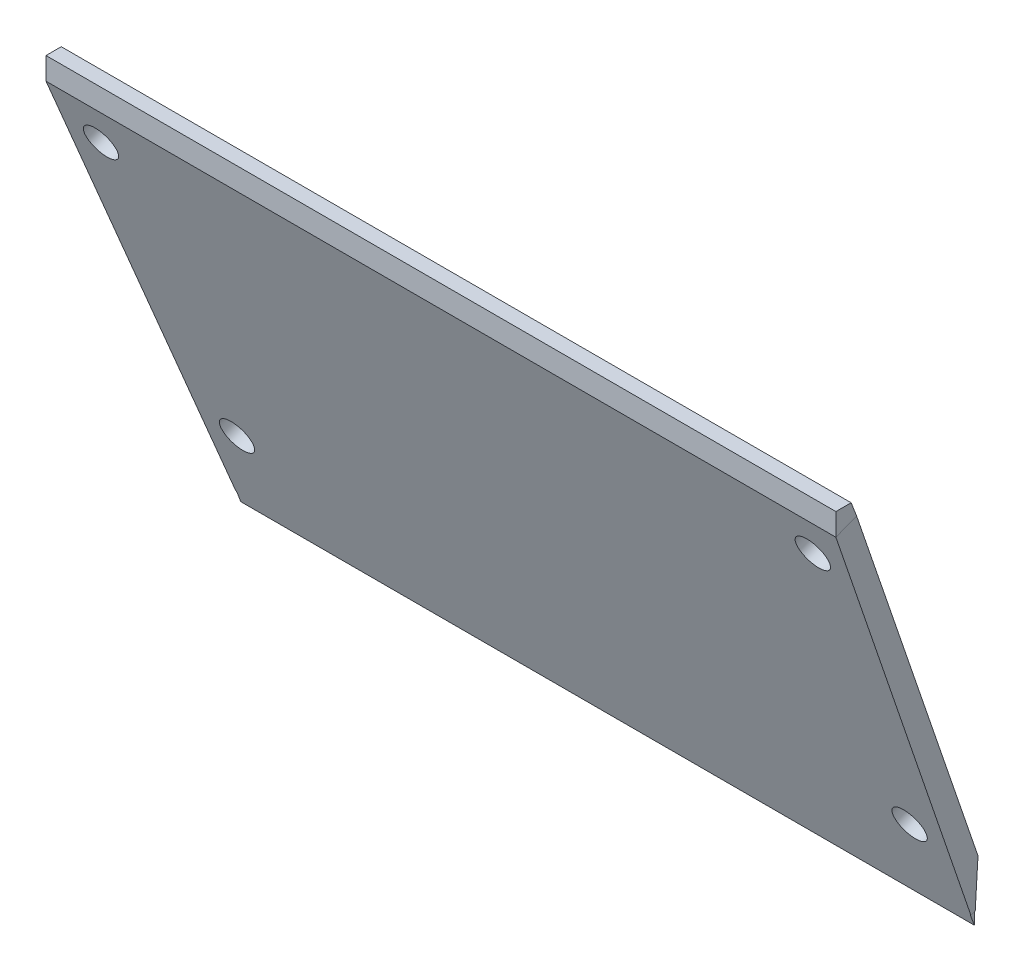
ISO-10303-21;
HEADER;
FILE_DESCRIPTION(('STEP AP214'),'2;1');
FILE_NAME('part.step','',(''),(''),'','','');
FILE_SCHEMA(('AUTOMOTIVE_DESIGN { 1 0 10303 214 1 1 1 1 }'));
ENDSEC;
DATA;
#1=APPLICATION_CONTEXT('core data for automotive mechanical design processes');
#2=APPLICATION_PROTOCOL_DEFINITION('international standard','automotive_design',2000,#1);
#3=PRODUCT_CONTEXT('',#1,'mechanical');
#4=PRODUCT('Part','Part','',(#3));
#5=PRODUCT_RELATED_PRODUCT_CATEGORY('part','',(#4));
#6=PRODUCT_DEFINITION_FORMATION('','',#4);
#7=PRODUCT_DEFINITION_CONTEXT('part definition',#1,'design');
#8=PRODUCT_DEFINITION('design','',#6,#7);
#9=PRODUCT_DEFINITION_SHAPE('','',#8);
#10=(LENGTH_UNIT() NAMED_UNIT(*) SI_UNIT(.MILLI.,.METRE.));
#11=(NAMED_UNIT(*) PLANE_ANGLE_UNIT() SI_UNIT($,.RADIAN.));
#12=(NAMED_UNIT(*) SI_UNIT($,.STERADIAN.) SOLID_ANGLE_UNIT());
#13=UNCERTAINTY_MEASURE_WITH_UNIT(LENGTH_MEASURE(1.E-05),#10,'distance_accuracy_value','');
#14=(GEOMETRIC_REPRESENTATION_CONTEXT(3) GLOBAL_UNCERTAINTY_ASSIGNED_CONTEXT((#13)) GLOBAL_UNIT_ASSIGNED_CONTEXT((#10,
#11,#12)) REPRESENTATION_CONTEXT('',''));
#15=CARTESIAN_POINT('',(0.,0.,0.));
#16=DIRECTION('',(0.,0.,1.));
#17=DIRECTION('',(1.,0.,0.));
#18=AXIS2_PLACEMENT_3D('',#15,#16,#17);
#19=CARTESIAN_POINT('',(1.68999568881912E-12,-11.2833844757726,29.3367996370085));
#20=DIRECTION('',(0.,-0.358979079308871,0.933345606203059));
#21=DIRECTION('',(0.,-0.933345606203059,-0.358979079308871));
#22=AXIS2_PLACEMENT_3D('',#19,#20,#21);
#23=PLANE('',#22);
#24=DIRECTION('',(-1.,-1.48761816194893E-13,0.));
#25=VECTOR('',#24,1.);
#26=CARTESIAN_POINT('',(-1.15702182199236E-12,7.87405533269868,36.7050457171898));
#27=LINE('',#26,#25);
#28=CARTESIAN_POINT('',(33.2436036525895,7.87405533270565,36.7050457171906));
#29=VERTEX_POINT('',#28);
#30=CARTESIAN_POINT('',(-2.28590797378425,7.87405533270567,36.7050457171906));
#31=VERTEX_POINT('',#30);
#32=EDGE_CURVE('E157',#29,#31,#27,.T.);
#33=ORIENTED_EDGE('',*,*,#32,.T.);
#34=DIRECTION('',(-0.0604254999402851,0.931640113095444,0.358323120421325));
#35=VECTOR('',#34,1.);
#36=CARTESIAN_POINT('',(-1.05358179683291,-11.1259446672944,29.3973534094982));
#37=LINE('',#36,#35);
#38=CARTESIAN_POINT('',(-1.05358179683291,-11.1259446672944,29.3973534094982));
#39=VERTEX_POINT('',#38);
#40=EDGE_CURVE('E183',#39,#31,#37,.T.);
#41=ORIENTED_EDGE('',*,*,#40,.F.);
#42=DIRECTION('',(-1.,-4.27935352312021E-13,-1.06983838078005E-13));
#43=VECTOR('',#42,1.);
#44=CARTESIAN_POINT('',(-1.02115216059735,-11.1259446672944,29.3973534094982));
#45=LINE('',#44,#43);
#46=CARTESIAN_POINT('',(-1.02115216059735,-11.1259446672944,29.3973534094982));
#47=VERTEX_POINT('',#46);
#48=EDGE_CURVE('E170',#47,#39,#45,.T.);
#49=ORIENTED_EDGE('',*,*,#48,.F.);
#50=DIRECTION('',(0.,0.933345606203061,0.358979079308865));
#51=VECTOR('',#50,1.);
#52=CARTESIAN_POINT('',(-1.02115216059735,-11.6259446672943,29.2050457171906));
#53=LINE('',#52,#51);
#54=CARTESIAN_POINT('',(-1.02115216059735,-11.6259446672975,29.2050457171893));
#55=VERTEX_POINT('',#54);
#56=EDGE_CURVE('E131',#55,#47,#53,.T.);
#57=ORIENTED_EDGE('',*,*,#56,.F.);
#58=DIRECTION('',(-1.,0.,0.));
#59=VECTOR('',#58,1.);
#60=CARTESIAN_POINT('',(31.9788478394027,-11.6259446672944,29.2050457171906));
#61=LINE('',#60,#59);
#62=CARTESIAN_POINT('',(31.9788478394027,-11.6259446672944,29.2050457171906));
#63=VERTEX_POINT('',#62);
#64=EDGE_CURVE('E110',#63,#55,#61,.T.);
#65=ORIENTED_EDGE('',*,*,#64,.F.);
#66=DIRECTION('',(0.,-0.933345606203059,-0.358979079308871));
#67=VECTOR('',#66,1.);
#68=CARTESIAN_POINT('',(31.9788478394026,-11.1259446672944,29.3973534094983));
#69=LINE('',#68,#67);
#70=CARTESIAN_POINT('',(31.9788478394026,-11.1259446672944,29.3973534094983));
#71=VERTEX_POINT('',#70);
#72=EDGE_CURVE('E119',#71,#63,#69,.T.);
#73=ORIENTED_EDGE('',*,*,#72,.F.);
#74=DIRECTION('',(-1.,0.,0.));
#75=VECTOR('',#74,1.);
#76=CARTESIAN_POINT('',(32.0112774756382,-11.1259446672944,29.3973534094983));
#77=LINE('',#76,#75);
#78=CARTESIAN_POINT('',(32.0112774756382,-11.1259446672944,29.3973534094983));
#79=VERTEX_POINT('',#78);
#80=EDGE_CURVE('E125',#79,#71,#77,.T.);
#81=ORIENTED_EDGE('',*,*,#80,.F.);
#82=DIRECTION('',(-0.0604254999402827,-0.931640113095444,-0.358323120421325));
#83=VECTOR('',#82,1.);
#84=CARTESIAN_POINT('',(33.2436036525895,7.87405533270565,36.7050457171906));
#85=LINE('',#84,#83);
#86=EDGE_CURVE('E186',#29,#79,#85,.T.);
#87=ORIENTED_EDGE('',*,*,#86,.F.);
#88=EDGE_LOOP('',(#33,#41,#49,#57,#65,#73,#81,#87));
#89=FACE_BOUND('',#88,.T.);
#90=CARTESIAN_POINT('',(31.4889417867279,6.0073641217094,35.9870875591478));
#91=DIRECTION('',(0.,0.358979079308869,-0.93334560620306));
#92=DIRECTION('',(0.,0.93334560620306,0.358979079308869));
#93=AXIS2_PLACEMENT_3D('',#90,#91,#92);
#94=CIRCLE('',#93,0.749999999999998);
#95=CARTESIAN_POINT('',(31.4889417867279,6.70737332636169,36.2563218686294));
#96=VERTEX_POINT('',#95);
#97=EDGE_CURVE('E226',#96,#96,#94,.T.);
#98=ORIENTED_EDGE('',*,*,#97,.T.);
#99=EDGE_LOOP('',(#98));
#100=FACE_BOUND('',#99,.T.);
#101=CARTESIAN_POINT('',(0.351610096524478,-7.60450925656272,30.7517516444278));
#102=DIRECTION('',(0.,0.358979079308869,-0.93334560620306));
#103=DIRECTION('',(0.,-0.93334560620306,-0.358979079308869));
#104=AXIS2_PLACEMENT_3D('',#101,#102,#103);
#105=CIRCLE('',#104,0.749999999999998);
#106=CARTESIAN_POINT('',(0.351610096524478,-8.30451846121501,30.4825173349461));
#107=VERTEX_POINT('',#106);
#108=EDGE_CURVE('E238',#107,#107,#105,.T.);
#109=ORIENTED_EDGE('',*,*,#108,.T.);
#110=EDGE_LOOP('',(#109));
#111=FACE_BOUND('',#110,.T.);
#112=CARTESIAN_POINT('',(-0.531246107759252,6.00736412170941,35.9870875591478));
#113=DIRECTION('',(0.,0.358979079308869,-0.93334560620306));
#114=DIRECTION('',(0.,-0.93334560620306,-0.358979079308869));
#115=AXIS2_PLACEMENT_3D('',#112,#113,#114);
#116=CIRCLE('',#115,0.749999999999998);
#117=CARTESIAN_POINT('',(-0.531246107759252,5.30735491705711,35.7178532496662));
#118=VERTEX_POINT('',#117);
#119=EDGE_CURVE('E244',#118,#118,#116,.T.);
#120=ORIENTED_EDGE('',*,*,#119,.T.);
#121=EDGE_LOOP('',(#120));
#122=FACE_BOUND('',#121,.T.);
#123=CARTESIAN_POINT('',(30.6060855824442,-7.60450925656273,30.7517516444278));
#124=DIRECTION('',(0.,0.358979079308869,-0.93334560620306));
#125=DIRECTION('',(0.,0.93334560620306,0.358979079308869));
#126=AXIS2_PLACEMENT_3D('',#123,#124,#125);
#127=CIRCLE('',#126,0.749999999999998);
#128=CARTESIAN_POINT('',(30.6060855824442,-6.90450005191043,31.0209859539094));
#129=VERTEX_POINT('',#128);
#130=EDGE_CURVE('E232',#129,#129,#127,.T.);
#131=ORIENTED_EDGE('',*,*,#130,.T.);
#132=EDGE_LOOP('',(#131));
#133=FACE_BOUND('',#132,.T.);
#134=ADVANCED_FACE('F33',(#89,#100,#111,#122,#133),#23,.T.);
#135=CARTESIAN_POINT('',(1.69003140235229E-12,-10.9244053964637,28.4034540308054));
#136=DIRECTION('',(0.,-0.358979079308871,0.933345606203059));
#137=DIRECTION('',(0.,-0.933345606203059,-0.358979079308871));
#138=AXIS2_PLACEMENT_3D('',#135,#136,#137);
#139=PLANE('',#138);
#140=CARTESIAN_POINT('',(30.6060855824442,-7.24553017725386,29.8184060382247));
#141=DIRECTION('',(0.,0.358979079308869,-0.93334560620306));
#142=DIRECTION('',(0.,0.93334560620306,0.358979079308869));
#143=AXIS2_PLACEMENT_3D('',#140,#141,#142);
#144=CIRCLE('',#143,0.749999999999998);
#145=CARTESIAN_POINT('',(30.6060855824442,-6.54552097260156,30.0876403477063));
#146=VERTEX_POINT('',#145);
#147=EDGE_CURVE('E229',#146,#146,#144,.T.);
#148=ORIENTED_EDGE('',*,*,#147,.F.);
#149=EDGE_LOOP('',(#148));
#150=FACE_BOUND('',#149,.T.);
#151=CARTESIAN_POINT('',(-0.531246107759252,6.36634320101827,35.0537419529447));
#152=DIRECTION('',(0.,0.358979079308869,-0.93334560620306));
#153=DIRECTION('',(0.,-0.93334560620306,-0.358979079308869));
#154=AXIS2_PLACEMENT_3D('',#151,#152,#153);
#155=CIRCLE('',#154,0.749999999999998);
#156=CARTESIAN_POINT('',(-0.531246107759252,5.66633399636598,34.7845076434631));
#157=VERTEX_POINT('',#156);
#158=EDGE_CURVE('E241',#157,#157,#155,.T.);
#159=ORIENTED_EDGE('',*,*,#158,.F.);
#160=EDGE_LOOP('',(#159));
#161=FACE_BOUND('',#160,.T.);
#162=DIRECTION('',(-0.0604254999402827,-0.931640113095444,-0.358323120421325));
#163=VECTOR('',#162,1.);
#164=CARTESIAN_POINT('',(33.2436036525895,8.23303441201452,35.7717001109875));
#165=LINE('',#164,#163);
#166=CARTESIAN_POINT('',(33.2436036525895,8.23303441201452,35.7717001109875));
#167=VERTEX_POINT('',#166);
#168=CARTESIAN_POINT('',(32.136241743557,-8.84026701185753,29.2050457171906));
#169=VERTEX_POINT('',#168);
#170=EDGE_CURVE('E139',#167,#169,#165,.T.);
#171=ORIENTED_EDGE('',*,*,#170,.T.);
#172=DIRECTION('',(-1.,-2.465793440118E-13,0.));
#173=VECTOR('',#172,1.);
#174=CARTESIAN_POINT('',(1.14628144397871E-12,-8.84026701186545,29.2050457171894));
#175=LINE('',#174,#173);
#176=CARTESIAN_POINT('',(-1.17854606475123,-8.84026701186542,29.2050457171885));
#177=VERTEX_POINT('',#176);
#178=EDGE_CURVE('E11',#169,#177,#175,.T.);
#179=ORIENTED_EDGE('',*,*,#178,.T.);
#180=DIRECTION('',(-0.0604254999402851,0.931640113095444,0.358323120421325));
#181=VECTOR('',#180,1.);
#182=CARTESIAN_POINT('',(-1.05358179683291,-10.7669655879855,28.4640078032952));
#183=LINE('',#182,#181);
#184=CARTESIAN_POINT('',(-2.28590797378425,8.23303441201454,35.7717001109875));
#185=VERTEX_POINT('',#184);
#186=EDGE_CURVE('E133',#177,#185,#183,.T.);
#187=ORIENTED_EDGE('',*,*,#186,.T.);
#188=DIRECTION('',(0.,-0.93334560620306,-0.358979079308869));
#189=VECTOR('',#188,1.);
#190=CARTESIAN_POINT('',(-2.28590797378424,43.4125585780401,49.3022863286897));
#191=LINE('',#190,#189);
#192=CARTESIAN_POINT('',(-2.28590797378424,8.87405533389354,36.0182466194025));
#193=VERTEX_POINT('',#192);
#194=EDGE_CURVE('E164',#193,#185,#191,.T.);
#195=ORIENTED_EDGE('',*,*,#194,.F.);
#196=DIRECTION('',(1.,0.,0.));
#197=VECTOR('',#196,1.);
#198=CARTESIAN_POINT('',(33.2436036525895,8.87405533389354,36.0182466194025));
#199=LINE('',#198,#197);
#200=CARTESIAN_POINT('',(33.2436036525895,8.87405533389354,36.0182466194025));
#201=VERTEX_POINT('',#200);
#202=EDGE_CURVE('E168',#193,#201,#199,.T.);
#203=ORIENTED_EDGE('',*,*,#202,.T.);
#204=DIRECTION('',(0.,-0.93334560620306,-0.358979079308869));
#205=VECTOR('',#204,1.);
#206=CARTESIAN_POINT('',(33.2436036525895,43.4125585780401,49.3022863286897));
#207=LINE('',#206,#205);
#208=EDGE_CURVE('E173',#201,#167,#207,.T.);
#209=ORIENTED_EDGE('',*,*,#208,.T.);
#210=EDGE_LOOP('',(#171,#179,#187,#195,#203,#209));
#211=FACE_BOUND('',#210,.T.);
#212=CARTESIAN_POINT('',(0.351610096524478,-7.24553017725385,29.8184060382247));
#213=DIRECTION('',(0.,0.358979079308869,-0.93334560620306));
#214=DIRECTION('',(0.,-0.93334560620306,-0.358979079308869));
#215=AXIS2_PLACEMENT_3D('',#212,#213,#214);
#216=CIRCLE('',#215,0.749999999999998);
#217=CARTESIAN_POINT('',(0.351610096524478,-7.94553938190614,29.549171728743));
#218=VERTEX_POINT('',#217);
#219=EDGE_CURVE('E235',#218,#218,#216,.T.);
#220=ORIENTED_EDGE('',*,*,#219,.F.);
#221=EDGE_LOOP('',(#220));
#222=FACE_BOUND('',#221,.T.);
#223=CARTESIAN_POINT('',(31.4889417867279,6.36634320101827,35.0537419529447));
#224=DIRECTION('',(0.,0.358979079308869,-0.93334560620306));
#225=DIRECTION('',(0.,0.93334560620306,0.358979079308869));
#226=AXIS2_PLACEMENT_3D('',#223,#224,#225);
#227=CIRCLE('',#226,0.749999999999998);
#228=CARTESIAN_POINT('',(31.4889417867279,7.06635240567056,35.3229762624264));
#229=VERTEX_POINT('',#228);
#230=EDGE_CURVE('E225',#229,#229,#227,.T.);
#231=ORIENTED_EDGE('',*,*,#230,.F.);
#232=EDGE_LOOP('',(#231));
#233=FACE_BOUND('',#232,.T.);
#234=ADVANCED_FACE('F201',(#150,#161,#211,#222,#233),#139,.F.);
#235=CARTESIAN_POINT('',(33.2436036525895,43.0535794987312,50.2356319348927));
#236=DIRECTION('',(-1.,0.,0.));
#237=DIRECTION('',(0.,0.,1.));
#238=AXIS2_PLACEMENT_3D('',#235,#236,#237);
#239=PLANE('',#238);
#240=DIRECTION('',(0.,-1.,0.));
#241=VECTOR('',#240,1.);
#242=CARTESIAN_POINT('',(33.2436036525895,86.3197509479146,36.7050457171898));
#243=LINE('',#242,#241);
#244=CARTESIAN_POINT('',(33.2436036525895,8.87405533389354,36.7050457171898));
#245=VERTEX_POINT('',#244);
#246=EDGE_CURVE('E116',#245,#29,#243,.T.);
#247=ORIENTED_EDGE('',*,*,#246,.T.);
#248=DIRECTION('',(0.,-0.358979079308869,0.93334560620306));
#249=VECTOR('',#248,1.);
#250=CARTESIAN_POINT('',(33.2436036525895,8.23303441201452,35.7717001109875));
#251=LINE('',#250,#249);
#252=EDGE_CURVE('E143',#167,#29,#251,.T.);
#253=ORIENTED_EDGE('',*,*,#252,.F.);
#254=ORIENTED_EDGE('',*,*,#208,.F.);
#255=DIRECTION('',(0.,0.,1.));
#256=VECTOR('',#255,1.);
#257=CARTESIAN_POINT('',(33.2436036525894,8.87405533389354,50.2356319348927));
#258=LINE('',#257,#256);
#259=EDGE_CURVE('E165',#201,#245,#258,.T.);
#260=ORIENTED_EDGE('',*,*,#259,.T.);
#261=EDGE_LOOP('',(#247,#253,#254,#260));
#262=FACE_BOUND('',#261,.T.);
#263=ADVANCED_FACE('F197',(#262),#239,.F.);
#264=CARTESIAN_POINT('',(-2.28590797378424,43.4125585780401,49.3022863286897));
#265=DIRECTION('',(1.,0.,0.));
#266=DIRECTION('',(0.,0.,-1.));
#267=AXIS2_PLACEMENT_3D('',#264,#265,#266);
#268=PLANE('',#267);
#269=DIRECTION('',(0.,-1.,0.));
#270=VECTOR('',#269,1.);
#271=CARTESIAN_POINT('',(-2.28590797378428,86.3197509479146,36.7050457171898));
#272=LINE('',#271,#270);
#273=CARTESIAN_POINT('',(-2.28590797378428,8.87405533389354,36.7050457171898));
#274=VERTEX_POINT('',#273);
#275=EDGE_CURVE('E156',#274,#31,#272,.T.);
#276=ORIENTED_EDGE('',*,*,#275,.F.);
#277=DIRECTION('',(0.,0.,-1.));
#278=VECTOR('',#277,1.);
#279=CARTESIAN_POINT('',(-2.28590797378424,8.87405533389354,49.3022863286896));
#280=LINE('',#279,#278);
#281=EDGE_CURVE('E167',#274,#193,#280,.T.);
#282=ORIENTED_EDGE('',*,*,#281,.T.);
#283=ORIENTED_EDGE('',*,*,#194,.T.);
#284=DIRECTION('',(0.,-0.358979079308869,0.93334560620306));
#285=VECTOR('',#284,1.);
#286=CARTESIAN_POINT('',(-2.28590797378425,8.23303441201454,35.7717001109875));
#287=LINE('',#286,#285);
#288=EDGE_CURVE('E146',#185,#31,#287,.T.);
#289=ORIENTED_EDGE('',*,*,#288,.T.);
#290=EDGE_LOOP('',(#276,#282,#283,#289));
#291=FACE_BOUND('',#290,.T.);
#292=ADVANCED_FACE('F205',(#291),#268,.F.);
#293=CARTESIAN_POINT('',(160.237455751998,8.87405533389354,36.7050457179187));
#294=DIRECTION('',(0.,-1.,0.));
#295=DIRECTION('',(0.,0.,-1.));
#296=AXIS2_PLACEMENT_3D('',#293,#294,#295);
#297=PLANE('',#296);
#298=DIRECTION('',(-1.,0.,0.));
#299=VECTOR('',#298,1.);
#300=CARTESIAN_POINT('',(160.237455751998,8.87405533389354,36.7050457171897));
#301=LINE('',#300,#299);
#302=EDGE_CURVE('E41',#245,#274,#301,.T.);
#303=ORIENTED_EDGE('',*,*,#302,.F.);
#304=ORIENTED_EDGE('',*,*,#259,.F.);
#305=ORIENTED_EDGE('',*,*,#202,.F.);
#306=ORIENTED_EDGE('',*,*,#281,.F.);
#307=EDGE_LOOP('',(#303,#304,#305,#306));
#308=FACE_BOUND('',#307,.T.);
#309=ADVANCED_FACE('F203',(#308),#297,.F.);
#310=CARTESIAN_POINT('',(-1.02115216059735,-10.7669655879855,28.4640078032952));
#311=DIRECTION('',(-4.37816540513554E-13,0.93334560620306,0.358979079308869));
#312=DIRECTION('',(0.,-0.358979079308869,0.93334560620306));
#313=AXIS2_PLACEMENT_3D('',#310,#311,#312);
#314=PLANE('',#313);
#315=DIRECTION('',(0.,-0.358979079308869,0.93334560620306));
#316=VECTOR('',#315,1.);
#317=CARTESIAN_POINT('',(-1.05358179683291,-10.7669655879855,28.4640078032952));
#318=LINE('',#317,#316);
#319=CARTESIAN_POINT('',(-1.05358179683291,-11.0519801702525,29.2050457171893));
#320=VERTEX_POINT('',#319);
#321=EDGE_CURVE('E149',#320,#39,#318,.T.);
#322=ORIENTED_EDGE('',*,*,#321,.F.);
#323=DIRECTION('',(1.,4.54763164190751E-13,0.));
#324=VECTOR('',#323,1.);
#325=CARTESIAN_POINT('',(-1.02115216059725,-11.0519801702525,29.2050457171893));
#326=LINE('',#325,#324);
#327=CARTESIAN_POINT('',(-1.02115216059735,-11.0519801702525,29.2050457171893));
#328=VERTEX_POINT('',#327);
#329=EDGE_CURVE('E214',#320,#328,#326,.T.);
#330=ORIENTED_EDGE('',*,*,#329,.T.);
#331=DIRECTION('',(0.,-0.358979079308869,0.93334560620306));
#332=VECTOR('',#331,1.);
#333=CARTESIAN_POINT('',(-1.02115216059735,-10.7669655879855,28.4640078032952));
#334=LINE('',#333,#332);
#335=EDGE_CURVE('E137',#328,#47,#334,.T.);
#336=ORIENTED_EDGE('',*,*,#335,.T.);
#337=ORIENTED_EDGE('',*,*,#48,.T.);
#338=EDGE_LOOP('',(#322,#330,#336,#337));
#339=FACE_BOUND('',#338,.T.);
#340=ADVANCED_FACE('F35',(#339),#314,.F.);
#341=CARTESIAN_POINT('',(-1.05358179683291,-10.7669655879855,28.4640078032952));
#342=DIRECTION('',(0.998172709984082,0.0563978748718883,0.0216914903353417));
#343=DIRECTION('',(-0.0564111477412176,0.998407623373599,0.));
#344=AXIS2_PLACEMENT_3D('',#341,#342,#343);
#345=PLANE('',#344);
#346=ORIENTED_EDGE('',*,*,#186,.F.);
#347=DIRECTION('',(0.0564111477412176,-0.998407623373599,0.));
#348=VECTOR('',#347,1.);
#349=CARTESIAN_POINT('',(-1.06963419431064,-10.7678725664024,29.2050457171893));
#350=LINE('',#349,#348);
#351=EDGE_CURVE('E48',#177,#320,#350,.T.);
#352=ORIENTED_EDGE('',*,*,#351,.T.);
#353=ORIENTED_EDGE('',*,*,#321,.T.);
#354=ORIENTED_EDGE('',*,*,#40,.T.);
#355=ORIENTED_EDGE('',*,*,#288,.F.);
#356=EDGE_LOOP('',(#346,#352,#353,#354,#355));
#357=FACE_BOUND('',#356,.T.);
#358=ADVANCED_FACE('F209',(#357),#345,.F.);
#359=CARTESIAN_POINT('',(33.2436036525895,8.23303441201452,35.7717001109875));
#360=DIRECTION('',(-0.998172709984082,0.0563978748718861,0.0216914903353408));
#361=DIRECTION('',(-0.0564111477412154,-0.998407623373599,0.));
#362=AXIS2_PLACEMENT_3D('',#359,#360,#361);
#363=PLANE('',#362);
#364=DIRECTION('',(0.,-0.358979079308869,0.93334560620306));
#365=VECTOR('',#364,1.);
#366=CARTESIAN_POINT('',(32.0112774756382,-10.7669655879855,28.4640078032952));
#367=LINE('',#366,#365);
#368=CARTESIAN_POINT('',(32.0112774756382,-11.051980170253,29.2050457171906));
#369=VERTEX_POINT('',#368);
#370=EDGE_CURVE('E141',#369,#79,#367,.T.);
#371=ORIENTED_EDGE('',*,*,#370,.F.);
#372=DIRECTION('',(0.0564111477412155,0.998407623373599,0.));
#373=VECTOR('',#372,1.);
#374=CARTESIAN_POINT('',(33.1013564821658,8.24107153628992,29.2050457171906));
#375=LINE('',#374,#373);
#376=EDGE_CURVE('E223',#369,#169,#375,.T.);
#377=ORIENTED_EDGE('',*,*,#376,.T.);
#378=ORIENTED_EDGE('',*,*,#170,.F.);
#379=ORIENTED_EDGE('',*,*,#252,.T.);
#380=ORIENTED_EDGE('',*,*,#86,.T.);
#381=EDGE_LOOP('',(#371,#377,#378,#379,#380));
#382=FACE_BOUND('',#381,.T.);
#383=ADVANCED_FACE('F194',(#382),#363,.F.);
#384=CARTESIAN_POINT('',(32.0112774756382,-10.7669655879855,28.4640078032952));
#385=DIRECTION('',(0.,0.93334560620306,0.358979079308869));
#386=DIRECTION('',(0.,-0.358979079308869,0.93334560620306));
#387=AXIS2_PLACEMENT_3D('',#384,#385,#386);
#388=PLANE('',#387);
#389=DIRECTION('',(0.,-0.358979079308869,0.93334560620306));
#390=VECTOR('',#389,1.);
#391=CARTESIAN_POINT('',(31.9788478394026,-10.7669655879855,28.4640078032952));
#392=LINE('',#391,#390);
#393=CARTESIAN_POINT('',(31.9788478394026,-11.0519801702529,29.2050457171906));
#394=VERTEX_POINT('',#393);
#395=EDGE_CURVE('E121',#394,#71,#392,.T.);
#396=ORIENTED_EDGE('',*,*,#395,.F.);
#397=DIRECTION('',(1.,0.,0.));
#398=VECTOR('',#397,1.);
#399=CARTESIAN_POINT('',(32.0112774756382,-11.0519801702529,29.2050457171906));
#400=LINE('',#399,#398);
#401=EDGE_CURVE('E113',#394,#369,#400,.T.);
#402=ORIENTED_EDGE('',*,*,#401,.T.);
#403=ORIENTED_EDGE('',*,*,#370,.T.);
#404=ORIENTED_EDGE('',*,*,#80,.T.);
#405=EDGE_LOOP('',(#396,#402,#403,#404));
#406=FACE_BOUND('',#405,.T.);
#407=ADVANCED_FACE('F189',(#406),#388,.F.);
#408=CARTESIAN_POINT('',(31.9788478394026,-10.7669655879855,28.4640078032952));
#409=DIRECTION('',(-1.,0.,0.));
#410=DIRECTION('',(0.,-1.,0.));
#411=AXIS2_PLACEMENT_3D('',#408,#409,#410);
#412=PLANE('',#411);
#413=ORIENTED_EDGE('',*,*,#72,.T.);
#414=DIRECTION('',(0.,1.,0.));
#415=VECTOR('',#414,1.);
#416=CARTESIAN_POINT('',(31.9788478394026,-10.7669655879855,29.2050457171906));
#417=LINE('',#416,#415);
#418=EDGE_CURVE('E106',#63,#394,#417,.T.);
#419=ORIENTED_EDGE('',*,*,#418,.T.);
#420=ORIENTED_EDGE('',*,*,#395,.T.);
#421=EDGE_LOOP('',(#413,#419,#420));
#422=FACE_BOUND('',#421,.T.);
#423=ADVANCED_FACE('F120',(#422),#412,.F.);
#424=CARTESIAN_POINT('',(-1.02115216059735,-11.2669655879855,28.2717001109875));
#425=DIRECTION('',(1.,0.,0.));
#426=DIRECTION('',(0.,1.,0.));
#427=AXIS2_PLACEMENT_3D('',#424,#425,#426);
#428=PLANE('',#427);
#429=ORIENTED_EDGE('',*,*,#335,.F.);
#430=DIRECTION('',(0.,-1.,0.));
#431=VECTOR('',#430,1.);
#432=CARTESIAN_POINT('',(-1.02115216059735,-11.2669655879855,29.2050457171893));
#433=LINE('',#432,#431);
#434=EDGE_CURVE('E217',#328,#55,#433,.T.);
#435=ORIENTED_EDGE('',*,*,#434,.T.);
#436=ORIENTED_EDGE('',*,*,#56,.T.);
#437=EDGE_LOOP('',(#429,#435,#436));
#438=FACE_BOUND('',#437,.T.);
#439=ADVANCED_FACE('F216',(#438),#428,.F.);
#440=CARTESIAN_POINT('',(33.2436036525895,86.3197509479146,36.7050457171898));
#441=DIRECTION('',(0.,0.,1.));
#442=DIRECTION('',(1.,0.,0.));
#443=AXIS2_PLACEMENT_3D('',#440,#441,#442);
#444=PLANE('',#443);
#445=ORIENTED_EDGE('',*,*,#32,.F.);
#446=ORIENTED_EDGE('',*,*,#246,.F.);
#447=ORIENTED_EDGE('',*,*,#302,.T.);
#448=ORIENTED_EDGE('',*,*,#275,.T.);
#449=EDGE_LOOP('',(#445,#446,#447,#448));
#450=FACE_BOUND('',#449,.T.);
#451=ADVANCED_FACE('F154',(#450),#444,.T.);
#452=CARTESIAN_POINT('',(85.9065557963402,-11.6259446672891,29.2050457171926));
#453=DIRECTION('',(0.,0.,1.));
#454=DIRECTION('',(1.,0.,0.));
#455=AXIS2_PLACEMENT_3D('',#452,#453,#454);
#456=PLANE('',#455);
#457=ORIENTED_EDGE('',*,*,#418,.F.);
#458=ORIENTED_EDGE('',*,*,#64,.T.);
#459=ORIENTED_EDGE('',*,*,#434,.F.);
#460=ORIENTED_EDGE('',*,*,#329,.F.);
#461=ORIENTED_EDGE('',*,*,#351,.F.);
#462=ORIENTED_EDGE('',*,*,#178,.F.);
#463=ORIENTED_EDGE('',*,*,#376,.F.);
#464=ORIENTED_EDGE('',*,*,#401,.F.);
#465=EDGE_LOOP('',(#457,#458,#459,#460,#461,#462,#463,#464));
#466=FACE_BOUND('',#465,.T.);
#467=ADVANCED_FACE('F108',(#466),#456,.F.);
#468=CARTESIAN_POINT('',(-0.531246107759252,6.36634320101827,35.0537419529447));
#469=DIRECTION('',(0.,-0.358979079308869,0.93334560620306));
#470=DIRECTION('',(0.,-0.93334560620306,-0.358979079308869));
#471=AXIS2_PLACEMENT_3D('',#468,#469,#470);
#472=CYLINDRICAL_SURFACE('',#471,0.749999999999998);
#473=ORIENTED_EDGE('',*,*,#158,.T.);
#474=EDGE_LOOP('',(#473));
#475=FACE_BOUND('',#474,.T.);
#476=ORIENTED_EDGE('',*,*,#119,.F.);
#477=EDGE_LOOP('',(#476));
#478=FACE_BOUND('',#477,.T.);
#479=ADVANCED_FACE('F250',(#475,#478),#472,.F.);
#480=CARTESIAN_POINT('',(0.351610096524478,-7.24553017725385,29.8184060382247));
#481=DIRECTION('',(0.,-0.358979079308869,0.93334560620306));
#482=DIRECTION('',(0.,-0.93334560620306,-0.358979079308869));
#483=AXIS2_PLACEMENT_3D('',#480,#481,#482);
#484=CYLINDRICAL_SURFACE('',#483,0.749999999999998);
#485=ORIENTED_EDGE('',*,*,#219,.T.);
#486=EDGE_LOOP('',(#485));
#487=FACE_BOUND('',#486,.T.);
#488=ORIENTED_EDGE('',*,*,#108,.F.);
#489=EDGE_LOOP('',(#488));
#490=FACE_BOUND('',#489,.T.);
#491=ADVANCED_FACE('F295',(#487,#490),#484,.F.);
#492=CARTESIAN_POINT('',(30.6060855824442,-7.24553017725386,29.8184060382247));
#493=DIRECTION('',(0.,-0.358979079308869,0.93334560620306));
#494=DIRECTION('',(0.,-0.93334560620306,-0.358979079308869));
#495=AXIS2_PLACEMENT_3D('',#492,#493,#494);
#496=CYLINDRICAL_SURFACE('',#495,0.749999999999998);
#497=ORIENTED_EDGE('',*,*,#147,.T.);
#498=EDGE_LOOP('',(#497));
#499=FACE_BOUND('',#498,.T.);
#500=ORIENTED_EDGE('',*,*,#130,.F.);
#501=EDGE_LOOP('',(#500));
#502=FACE_BOUND('',#501,.T.);
#503=ADVANCED_FACE('F291',(#499,#502),#496,.F.);
#504=CARTESIAN_POINT('',(31.4889417867279,6.36634320101827,35.0537419529447));
#505=DIRECTION('',(0.,-0.358979079308869,0.93334560620306));
#506=DIRECTION('',(0.,-0.93334560620306,-0.358979079308869));
#507=AXIS2_PLACEMENT_3D('',#504,#505,#506);
#508=CYLINDRICAL_SURFACE('',#507,0.749999999999998);
#509=ORIENTED_EDGE('',*,*,#230,.T.);
#510=EDGE_LOOP('',(#509));
#511=FACE_BOUND('',#510,.T.);
#512=ORIENTED_EDGE('',*,*,#97,.F.);
#513=EDGE_LOOP('',(#512));
#514=FACE_BOUND('',#513,.T.);
#515=ADVANCED_FACE('F288',(#511,#514),#508,.F.);
#516=CLOSED_SHELL('',(#134,#234,#263,#292,#309,#340,#358,#383,#407,#423,#439,#451,#467,#479,
#491,#503,#515));
#517=MANIFOLD_SOLID_BREP('B2',#516);
#518=ADVANCED_BREP_SHAPE_REPRESENTATION('',(#18,#517),#14);
#519=SHAPE_DEFINITION_REPRESENTATION(#9,#518);
ENDSEC;
END-ISO-10303-21;
